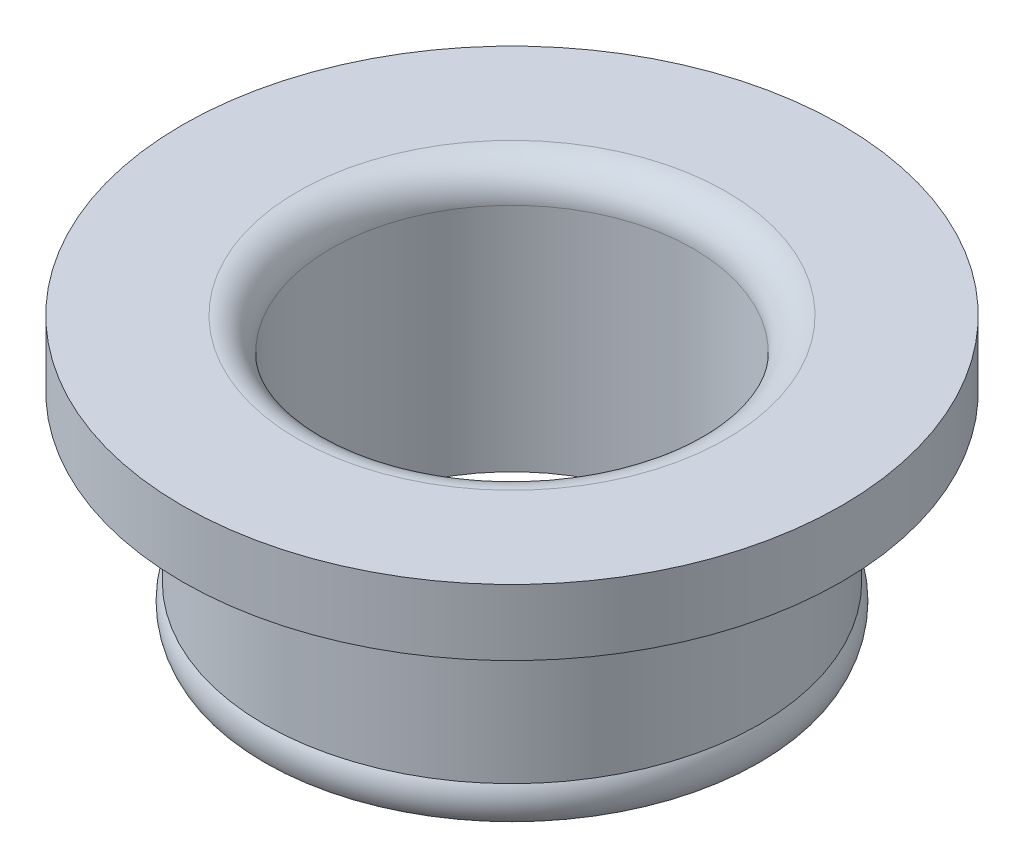
ISO-10303-21;
HEADER;
FILE_DESCRIPTION(('STEP AP214'),'2;1');
FILE_NAME('part.step','',(''),(''),'','','');
FILE_SCHEMA(('AUTOMOTIVE_DESIGN { 1 0 10303 214 1 1 1 1 }'));
ENDSEC;
DATA;
#1=APPLICATION_CONTEXT('core data for automotive mechanical design processes');
#2=APPLICATION_PROTOCOL_DEFINITION('international standard','automotive_design',2000,#1);
#3=PRODUCT_CONTEXT('',#1,'mechanical');
#4=PRODUCT('Part','Part','',(#3));
#5=PRODUCT_RELATED_PRODUCT_CATEGORY('part','',(#4));
#6=PRODUCT_DEFINITION_FORMATION('','',#4);
#7=PRODUCT_DEFINITION_CONTEXT('part definition',#1,'design');
#8=PRODUCT_DEFINITION('design','',#6,#7);
#9=PRODUCT_DEFINITION_SHAPE('','',#8);
#10=(LENGTH_UNIT() NAMED_UNIT(*) SI_UNIT(.MILLI.,.METRE.));
#11=(NAMED_UNIT(*) PLANE_ANGLE_UNIT() SI_UNIT($,.RADIAN.));
#12=(NAMED_UNIT(*) SI_UNIT($,.STERADIAN.) SOLID_ANGLE_UNIT());
#13=UNCERTAINTY_MEASURE_WITH_UNIT(LENGTH_MEASURE(1.E-05),#10,'distance_accuracy_value','');
#14=(GEOMETRIC_REPRESENTATION_CONTEXT(3) GLOBAL_UNCERTAINTY_ASSIGNED_CONTEXT((#13)) GLOBAL_UNIT_ASSIGNED_CONTEXT((#10,
#11,#12)) REPRESENTATION_CONTEXT('',''));
#15=CARTESIAN_POINT('',(0.,0.,0.));
#16=DIRECTION('',(0.,0.,1.));
#17=DIRECTION('',(1.,0.,0.));
#18=AXIS2_PLACEMENT_3D('',#15,#16,#17);
#19=CARTESIAN_POINT('',(0.,-7.62,0.));
#20=DIRECTION('',(0.,1.,0.));
#21=DIRECTION('',(0.,0.,1.));
#22=AXIS2_PLACEMENT_3D('',#19,#20,#21);
#23=CYLINDRICAL_SURFACE('',#22,9.525);
#24=CARTESIAN_POINT('',(0.,-0.762,0.));
#25=DIRECTION('',(0.,1.,0.));
#26=DIRECTION('',(0.,0.,1.));
#27=AXIS2_PLACEMENT_3D('',#24,#25,#26);
#28=CIRCLE('',#27,9.525);
#29=CARTESIAN_POINT('',(0.,-0.762000000000001,9.525));
#30=VERTEX_POINT('',#29);
#31=EDGE_CURVE('E11',#30,#30,#28,.F.);
#32=CARTESIAN_POINT('',(0.,-6.35,0.));
#33=DIRECTION('',(0.,1.,0.));
#34=DIRECTION('',(0.,0.,1.));
#35=AXIS2_PLACEMENT_3D('',#32,#33,#34);
#36=CIRCLE('',#35,9.525);
#37=CARTESIAN_POINT('',(0.,-6.35,9.525));
#38=VERTEX_POINT('',#37);
#39=EDGE_CURVE('E93',#38,#38,#36,.T.);
#40=CARTESIAN_POINT('',(0.,-0.762000000000001,9.525));
#41=CARTESIAN_POINT('',(0.,-0.820208333333334,9.525));
#42=CARTESIAN_POINT('',(0.,-0.878416666666667,9.525));
#43=CARTESIAN_POINT('',(0.,-0.994833333333334,9.525));
#44=CARTESIAN_POINT('',(0.,-1.05304166666667,9.525));
#45=CARTESIAN_POINT('',(0.,-1.16945833333333,9.525));
#46=CARTESIAN_POINT('',(0.,-1.22766666666667,9.525));
#47=CARTESIAN_POINT('',(0.,-1.34408333333333,9.525));
#48=CARTESIAN_POINT('',(0.,-1.40229166666667,9.525));
#49=CARTESIAN_POINT('',(0.,-1.51870833333333,9.525));
#50=CARTESIAN_POINT('',(0.,-1.57691666666667,9.525));
#51=CARTESIAN_POINT('',(0.,-1.69333333333333,9.525));
#52=CARTESIAN_POINT('',(0.,-1.75154166666667,9.525));
#53=CARTESIAN_POINT('',(0.,-1.86795833333333,9.525));
#54=CARTESIAN_POINT('',(0.,-1.92616666666667,9.525));
#55=CARTESIAN_POINT('',(0.,-2.04258333333333,9.525));
#56=CARTESIAN_POINT('',(0.,-2.10079166666667,9.525));
#57=CARTESIAN_POINT('',(0.,-2.21720833333333,9.525));
#58=CARTESIAN_POINT('',(0.,-2.27541666666667,9.525));
#59=CARTESIAN_POINT('',(0.,-2.39183333333333,9.525));
#60=CARTESIAN_POINT('',(0.,-2.45004166666667,9.525));
#61=CARTESIAN_POINT('',(0.,-2.56645833333333,9.525));
#62=CARTESIAN_POINT('',(0.,-2.62466666666667,9.525));
#63=CARTESIAN_POINT('',(0.,-2.74108333333333,9.525));
#64=CARTESIAN_POINT('',(0.,-2.79929166666667,9.525));
#65=CARTESIAN_POINT('',(0.,-2.91570833333333,9.525));
#66=CARTESIAN_POINT('',(0.,-2.97391666666667,9.525));
#67=CARTESIAN_POINT('',(0.,-3.09033333333333,9.525));
#68=CARTESIAN_POINT('',(0.,-3.14854166666667,9.525));
#69=CARTESIAN_POINT('',(0.,-3.26495833333333,9.525));
#70=CARTESIAN_POINT('',(0.,-3.32316666666667,9.525));
#71=CARTESIAN_POINT('',(0.,-3.43958333333333,9.525));
#72=CARTESIAN_POINT('',(0.,-3.49779166666667,9.525));
#73=CARTESIAN_POINT('',(0.,-3.61420833333333,9.525));
#74=CARTESIAN_POINT('',(0.,-3.67241666666667,9.525));
#75=CARTESIAN_POINT('',(0.,-3.78883333333333,9.525));
#76=CARTESIAN_POINT('',(0.,-3.84704166666667,9.525));
#77=CARTESIAN_POINT('',(0.,-3.96345833333333,9.525));
#78=CARTESIAN_POINT('',(0.,-4.02166666666667,9.525));
#79=CARTESIAN_POINT('',(0.,-4.13808333333333,9.525));
#80=CARTESIAN_POINT('',(0.,-4.19629166666667,9.525));
#81=CARTESIAN_POINT('',(0.,-4.31270833333333,9.525));
#82=CARTESIAN_POINT('',(0.,-4.37091666666667,9.525));
#83=CARTESIAN_POINT('',(0.,-4.48733333333333,9.525));
#84=CARTESIAN_POINT('',(0.,-4.54554166666667,9.525));
#85=CARTESIAN_POINT('',(0.,-4.66195833333333,9.525));
#86=CARTESIAN_POINT('',(0.,-4.72016666666667,9.525));
#87=CARTESIAN_POINT('',(0.,-4.83658333333333,9.525));
#88=CARTESIAN_POINT('',(0.,-4.89479166666667,9.525));
#89=CARTESIAN_POINT('',(0.,-5.01120833333333,9.525));
#90=CARTESIAN_POINT('',(0.,-5.06941666666667,9.525));
#91=CARTESIAN_POINT('',(0.,-5.18583333333333,9.525));
#92=CARTESIAN_POINT('',(0.,-5.24404166666667,9.525));
#93=CARTESIAN_POINT('',(0.,-5.36045833333333,9.525));
#94=CARTESIAN_POINT('',(0.,-5.41866666666667,9.525));
#95=CARTESIAN_POINT('',(0.,-5.53508333333333,9.525));
#96=CARTESIAN_POINT('',(0.,-5.59329166666667,9.525));
#97=CARTESIAN_POINT('',(0.,-5.70970833333333,9.525));
#98=CARTESIAN_POINT('',(0.,-5.76791666666667,9.525));
#99=CARTESIAN_POINT('',(0.,-5.88433333333333,9.525));
#100=CARTESIAN_POINT('',(0.,-5.94254166666667,9.525));
#101=CARTESIAN_POINT('',(0.,-6.05895833333333,9.525));
#102=CARTESIAN_POINT('',(0.,-6.11716666666667,9.525));
#103=CARTESIAN_POINT('',(0.,-6.23358333333333,9.525));
#104=CARTESIAN_POINT('',(0.,-6.29179166666666,9.525));
#105=CARTESIAN_POINT('',(0.,-6.35,9.525));
#106=B_SPLINE_CURVE_WITH_KNOTS('',3,(#40,#41,#42,#43,#44,#45,#46,#47,#48,#49,#50,#51,#52,#53,
#54,#55,#56,#57,#58,#59,#60,#61,#62,#63,#64,#65,#66,#67,#68,#69,#70,#71,#72,#73,#74,#75,#76,#77,
#78,#79,#80,#81,#82,#83,#84,#85,#86,#87,#88,#89,#90,#91,#92,#93,#94,#95,#96,#97,#98,#99,#100,
#101,#102,#103,#104,#105),.UNSPECIFIED.,.F.,.F.,(4,2,2,2,2,2,2,2,2,2,2,2,2,2,2,2,2,2,2,2,2,2,2,
2,2,2,2,2,2,2,2,2,4),(0.,0.174625,0.34925,0.523875,0.698499999999999,0.873125,1.04775,1.222375,
1.397,1.571625,1.74625,1.920875,2.0955,2.270125,2.44475,2.619375,2.794,2.968625,3.14325,
3.317875,3.4925,3.667125,3.84175,4.016375,4.191,4.365625,4.54025,4.714875,4.8895,5.064125,
5.23875,5.413375,5.588),.UNSPECIFIED.);
#107=EDGE_CURVE('BSEAM53',#30,#38,#106,.T.);
#108=ORIENTED_EDGE('',*,*,#31,.T.);
#109=ORIENTED_EDGE('',*,*,#39,.T.);
#110=ORIENTED_EDGE('',*,*,#107,.T.);
#111=ORIENTED_EDGE('',*,*,#107,.F.);
#112=EDGE_LOOP('',(#108,#110,#109,#111));
#113=FACE_BOUND('',#112,.T.);
#114=ADVANCED_FACE('F53',(#113),#23,.T.);
#115=CARTESIAN_POINT('',(0.,2.54,0.));
#116=DIRECTION('',(0.,1.,0.));
#117=DIRECTION('',(0.,0.,1.));
#118=AXIS2_PLACEMENT_3D('',#115,#116,#117);
#119=PLANE('',#118);
#120=CARTESIAN_POINT('',(0.,2.54,0.));
#121=DIRECTION('',(0.,1.,0.));
#122=DIRECTION('',(0.,0.,1.));
#123=AXIS2_PLACEMENT_3D('',#120,#121,#122);
#124=CIRCLE('',#123,8.255);
#125=CARTESIAN_POINT('',(0.,2.54,8.255));
#126=VERTEX_POINT('',#125);
#127=EDGE_CURVE('E66',#126,#126,#124,.F.);
#128=ORIENTED_EDGE('',*,*,#127,.T.);
#129=EDGE_LOOP('',(#128));
#130=FACE_BOUND('',#129,.T.);
#131=CARTESIAN_POINT('',(0.,2.54,0.));
#132=DIRECTION('',(0.,1.,0.));
#133=DIRECTION('',(0.,0.,1.));
#134=AXIS2_PLACEMENT_3D('',#131,#132,#133);
#135=CIRCLE('',#134,12.7);
#136=CARTESIAN_POINT('',(0.,2.54,12.7));
#137=VERTEX_POINT('',#136);
#138=EDGE_CURVE('E77',#137,#137,#135,.T.);
#139=ORIENTED_EDGE('',*,*,#138,.T.);
#140=EDGE_LOOP('',(#139));
#141=FACE_BOUND('',#140,.T.);
#142=ADVANCED_FACE('F123',(#130,#141),#119,.T.);
#143=CARTESIAN_POINT('',(0.,0.,0.));
#144=DIRECTION('',(0.,1.,0.));
#145=DIRECTION('',(0.,0.,1.));
#146=AXIS2_PLACEMENT_3D('',#143,#144,#145);
#147=PLANE('',#146);
#148=CARTESIAN_POINT('',(0.,0.,0.));
#149=DIRECTION('',(0.,1.,0.));
#150=DIRECTION('',(0.,0.,1.));
#151=AXIS2_PLACEMENT_3D('',#148,#149,#150);
#152=CIRCLE('',#151,10.287);
#153=CARTESIAN_POINT('',(0.,0.,10.287));
#154=VERTEX_POINT('',#153);
#155=EDGE_CURVE('E61',#154,#154,#152,.T.);
#156=ORIENTED_EDGE('',*,*,#155,.T.);
#157=EDGE_LOOP('',(#156));
#158=FACE_BOUND('',#157,.T.);
#159=CARTESIAN_POINT('',(0.,0.,0.));
#160=DIRECTION('',(0.,1.,0.));
#161=DIRECTION('',(0.,0.,1.));
#162=AXIS2_PLACEMENT_3D('',#159,#160,#161);
#163=CIRCLE('',#162,12.7);
#164=CARTESIAN_POINT('',(0.,0.,12.7));
#165=VERTEX_POINT('',#164);
#166=EDGE_CURVE('E78',#165,#165,#163,.T.);
#167=ORIENTED_EDGE('',*,*,#166,.F.);
#168=EDGE_LOOP('',(#167));
#169=FACE_BOUND('',#168,.T.);
#170=ADVANCED_FACE('F127',(#158,#169),#147,.F.);
#171=CARTESIAN_POINT('',(0.,2.54,0.));
#172=DIRECTION('',(0.,-1.,0.));
#173=DIRECTION('',(0.,0.,-1.));
#174=AXIS2_PLACEMENT_3D('',#171,#172,#173);
#175=CYLINDRICAL_SURFACE('',#174,12.7);
#176=ORIENTED_EDGE('',*,*,#138,.F.);
#177=EDGE_LOOP('',(#176));
#178=FACE_BOUND('',#177,.T.);
#179=ORIENTED_EDGE('',*,*,#166,.T.);
#180=EDGE_LOOP('',(#179));
#181=FACE_BOUND('',#180,.T.);
#182=ADVANCED_FACE('F118',(#178,#181),#175,.T.);
#183=CARTESIAN_POINT('',(0.,2.54,0.));
#184=DIRECTION('',(0.,-1.,0.));
#185=DIRECTION('',(0.,0.,-1.));
#186=AXIS2_PLACEMENT_3D('',#183,#184,#185);
#187=CYLINDRICAL_SURFACE('',#186,6.985);
#188=CARTESIAN_POINT('',(0.,1.27,0.));
#189=DIRECTION('',(0.,1.,0.));
#190=DIRECTION('',(0.,0.,1.));
#191=AXIS2_PLACEMENT_3D('',#188,#189,#190);
#192=CIRCLE('',#191,6.985);
#193=CARTESIAN_POINT('',(0.,1.27,6.985));
#194=VERTEX_POINT('',#193);
#195=EDGE_CURVE('E71',#194,#194,#192,.T.);
#196=ORIENTED_EDGE('',*,*,#195,.T.);
#197=EDGE_LOOP('',(#196));
#198=FACE_BOUND('',#197,.T.);
#199=CARTESIAN_POINT('',(0.,-7.62,0.));
#200=DIRECTION('',(0.,1.,0.));
#201=DIRECTION('',(0.,0.,1.));
#202=AXIS2_PLACEMENT_3D('',#199,#200,#201);
#203=CIRCLE('',#202,6.985);
#204=CARTESIAN_POINT('',(0.,-7.62,6.985));
#205=VERTEX_POINT('',#204);
#206=EDGE_CURVE('E89',#205,#205,#203,.T.);
#207=ORIENTED_EDGE('',*,*,#206,.F.);
#208=EDGE_LOOP('',(#207));
#209=FACE_BOUND('',#208,.T.);
#210=ADVANCED_FACE('F108',(#198,#209),#187,.F.);
#211=CARTESIAN_POINT('',(0.,-7.62,0.));
#212=DIRECTION('',(0.,1.,0.));
#213=DIRECTION('',(0.,0.,1.));
#214=AXIS2_PLACEMENT_3D('',#211,#212,#213);
#215=PLANE('',#214);
#216=ORIENTED_EDGE('',*,*,#206,.T.);
#217=EDGE_LOOP('',(#216));
#218=FACE_BOUND('',#217,.T.);
#219=CARTESIAN_POINT('',(0.,-7.62,0.));
#220=DIRECTION('',(0.,1.,0.));
#221=DIRECTION('',(0.,0.,1.));
#222=AXIS2_PLACEMENT_3D('',#219,#220,#221);
#223=CIRCLE('',#222,9.525);
#224=CARTESIAN_POINT('',(0.,-7.62,9.525));
#225=VERTEX_POINT('',#224);
#226=EDGE_CURVE('E82',#225,#225,#223,.T.);
#227=ORIENTED_EDGE('',*,*,#226,.F.);
#228=EDGE_LOOP('',(#227));
#229=FACE_BOUND('',#228,.T.);
#230=ADVANCED_FACE('F105',(#218,#229),#215,.F.);
#231=CARTESIAN_POINT('',(0.,1.27,0.));
#232=DIRECTION('',(0.,1.,0.));
#233=DIRECTION('',(0.,0.,1.));
#234=AXIS2_PLACEMENT_3D('',#231,#232,#233);
#235=TOROIDAL_SURFACE('',#234,8.255,1.27);
#236=ORIENTED_EDGE('',*,*,#127,.F.);
#237=EDGE_LOOP('',(#236));
#238=FACE_BOUND('',#237,.T.);
#239=ORIENTED_EDGE('',*,*,#195,.F.);
#240=EDGE_LOOP('',(#239));
#241=FACE_BOUND('',#240,.T.);
#242=ADVANCED_FACE('F107',(#238,#241),#235,.T.);
#243=CARTESIAN_POINT('',(0.,-0.762,0.));
#244=DIRECTION('',(0.,1.,0.));
#245=DIRECTION('',(0.,0.,1.));
#246=AXIS2_PLACEMENT_3D('',#243,#244,#245);
#247=TOROIDAL_SURFACE('',#246,10.287,0.762);
#248=ORIENTED_EDGE('',*,*,#31,.F.);
#249=EDGE_LOOP('',(#248));
#250=FACE_BOUND('',#249,.T.);
#251=ORIENTED_EDGE('',*,*,#155,.F.);
#252=EDGE_LOOP('',(#251));
#253=FACE_BOUND('',#252,.T.);
#254=ADVANCED_FACE('F55',(#250,#253),#247,.F.);
#255=CARTESIAN_POINT('',(0.,-6.985,0.));
#256=DIRECTION('',(0.,1.,0.));
#257=DIRECTION('',(0.,0.,1.));
#258=AXIS2_PLACEMENT_3D('',#255,#256,#257);
#259=TOROIDAL_SURFACE('',#258,8.42514773719376,1.27);
#260=ORIENTED_EDGE('',*,*,#39,.F.);
#261=EDGE_LOOP('',(#260));
#262=FACE_BOUND('',#261,.T.);
#263=ORIENTED_EDGE('',*,*,#226,.T.);
#264=EDGE_LOOP('',(#263));
#265=FACE_BOUND('',#264,.T.);
#266=ADVANCED_FACE('F99',(#262,#265),#259,.T.);
#267=CLOSED_SHELL('',(#114,#142,#170,#182,#210,#230,#242,#254,#266));
#268=MANIFOLD_SOLID_BREP('B2',#267);
#269=ADVANCED_BREP_SHAPE_REPRESENTATION('',(#18,#268),#14);
#270=SHAPE_DEFINITION_REPRESENTATION(#9,#269);
ENDSEC;
END-ISO-10303-21;
